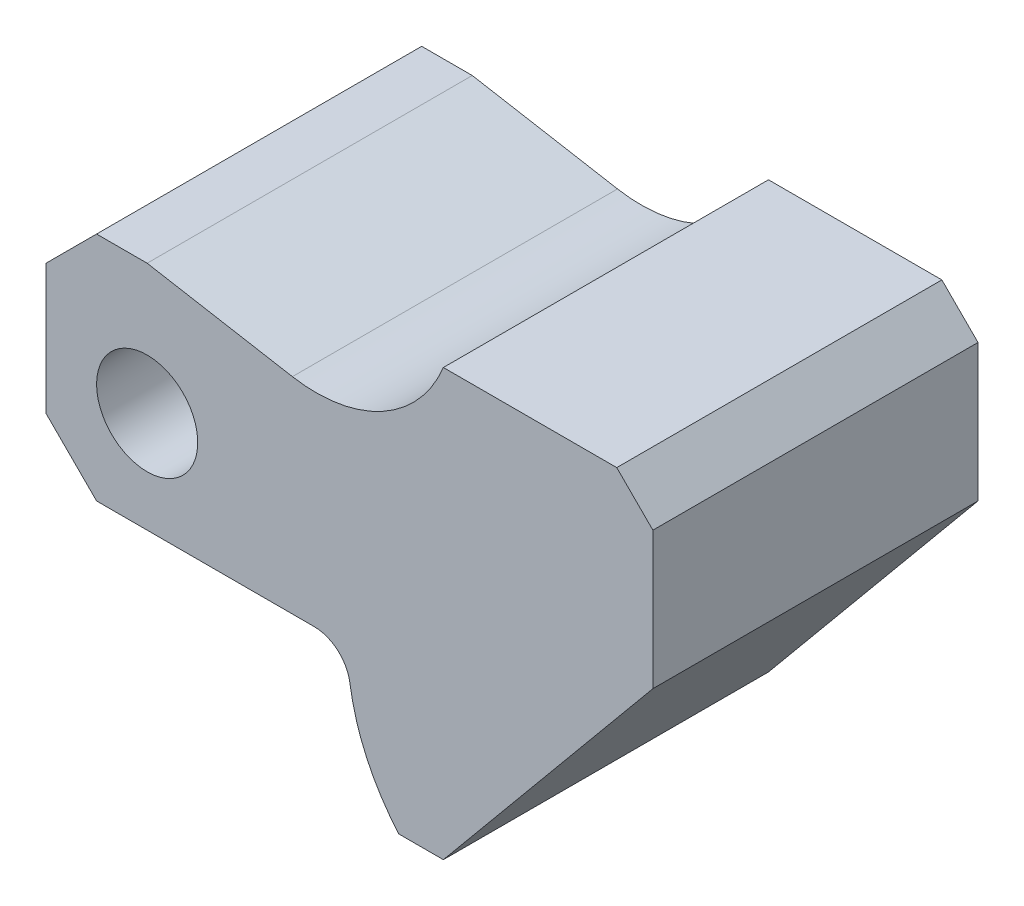
ISO-10303-21;
HEADER;
FILE_DESCRIPTION(('STEP AP214'),'2;1');
FILE_NAME('part.step','',(''),(''),'','','');
FILE_SCHEMA(('AUTOMOTIVE_DESIGN { 1 0 10303 214 1 1 1 1 }'));
ENDSEC;
DATA;
#1=APPLICATION_CONTEXT('core data for automotive mechanical design processes');
#2=APPLICATION_PROTOCOL_DEFINITION('international standard','automotive_design',2000,#1);
#3=PRODUCT_CONTEXT('',#1,'mechanical');
#4=PRODUCT('Part','Part','',(#3));
#5=PRODUCT_RELATED_PRODUCT_CATEGORY('part','',(#4));
#6=PRODUCT_DEFINITION_FORMATION('','',#4);
#7=PRODUCT_DEFINITION_CONTEXT('part definition',#1,'design');
#8=PRODUCT_DEFINITION('design','',#6,#7);
#9=PRODUCT_DEFINITION_SHAPE('','',#8);
#10=(LENGTH_UNIT() NAMED_UNIT(*) SI_UNIT(.MILLI.,.METRE.));
#11=(NAMED_UNIT(*) PLANE_ANGLE_UNIT() SI_UNIT($,.RADIAN.));
#12=(NAMED_UNIT(*) SI_UNIT($,.STERADIAN.) SOLID_ANGLE_UNIT());
#13=UNCERTAINTY_MEASURE_WITH_UNIT(LENGTH_MEASURE(1.E-05),#10,'distance_accuracy_value','');
#14=(GEOMETRIC_REPRESENTATION_CONTEXT(3) GLOBAL_UNCERTAINTY_ASSIGNED_CONTEXT((#13)) GLOBAL_UNIT_ASSIGNED_CONTEXT((#10,
#11,#12)) REPRESENTATION_CONTEXT('',''));
#15=CARTESIAN_POINT('',(0.,0.,0.));
#16=DIRECTION('',(0.,0.,1.));
#17=DIRECTION('',(1.,0.,0.));
#18=AXIS2_PLACEMENT_3D('',#15,#16,#17);
#19=CARTESIAN_POINT('',(20.4136649917998,3.9356435748019,45.));
#20=DIRECTION('',(0.,0.,-1.));
#21=DIRECTION('',(-1.,0.,0.));
#22=AXIS2_PLACEMENT_3D('',#19,#20,#21);
#23=PLANE('',#22);
#24=CARTESIAN_POINT('',(20.4136649917998,3.9356435748019,45.));
#25=DIRECTION('',(0.,0.,-1.));
#26=DIRECTION('',(-1.,0.,0.));
#27=AXIS2_PLACEMENT_3D('',#24,#25,#26);
#28=CIRCLE('',#27,19.);
#29=CARTESIAN_POINT('',(38.0103072641149,-3.23081864446441,45.));
#30=VERTEX_POINT('',#29);
#31=CARTESIAN_POINT('',(17.1143496161281,-14.7757037324301,45.));
#32=VERTEX_POINT('',#31);
#33=EDGE_CURVE('E224',#30,#32,#28,.T.);
#34=ORIENTED_EDGE('',*,*,#33,.T.);
#35=DIRECTION('',(-0.984807753012208,0.173648177666931,0.));
#36=VECTOR('',#35,1.);
#37=CARTESIAN_POINT('',(-2.98969273588509,-11.2308186444645,45.));
#38=LINE('',#37,#36);
#39=CARTESIAN_POINT('',(-2.98969273588509,-11.2308186444645,45.));
#40=VERTEX_POINT('',#39);
#41=EDGE_CURVE('E124',#32,#40,#38,.T.);
#42=ORIENTED_EDGE('',*,*,#41,.T.);
#43=DIRECTION('',(-1.,0.,0.));
#44=VECTOR('',#43,1.);
#45=CARTESIAN_POINT('',(-9.98969273588509,-11.2308186444645,45.));
#46=LINE('',#45,#44);
#47=CARTESIAN_POINT('',(-9.98969273588509,-11.2308186444645,45.));
#48=VERTEX_POINT('',#47);
#49=EDGE_CURVE('E269',#40,#48,#46,.T.);
#50=ORIENTED_EDGE('',*,*,#49,.T.);
#51=DIRECTION('',(-0.707106781186547,-0.707106781186548,0.));
#52=VECTOR('',#51,1.);
#53=CARTESIAN_POINT('',(-16.9896927358851,-18.2308186444645,45.));
#54=LINE('',#53,#52);
#55=CARTESIAN_POINT('',(-16.9896927358851,-18.2308186444645,45.));
#56=VERTEX_POINT('',#55);
#57=EDGE_CURVE('E289',#48,#56,#54,.T.);
#58=ORIENTED_EDGE('',*,*,#57,.T.);
#59=DIRECTION('',(0.,-1.,0.));
#60=VECTOR('',#59,1.);
#61=CARTESIAN_POINT('',(-16.9896927358851,-36.2308186444645,45.));
#62=LINE('',#61,#60);
#63=CARTESIAN_POINT('',(-16.9896927358851,-36.2308186444645,45.));
#64=VERTEX_POINT('',#63);
#65=EDGE_CURVE('E285',#56,#64,#62,.T.);
#66=ORIENTED_EDGE('',*,*,#65,.T.);
#67=DIRECTION('',(0.707106781186549,-0.707106781186546,0.));
#68=VECTOR('',#67,1.);
#69=CARTESIAN_POINT('',(-9.98969273588507,-43.2308186444645,45.));
#70=LINE('',#69,#68);
#71=CARTESIAN_POINT('',(-9.98969273588507,-43.2308186444645,45.));
#72=VERTEX_POINT('',#71);
#73=EDGE_CURVE('E288',#64,#72,#70,.T.);
#74=ORIENTED_EDGE('',*,*,#73,.T.);
#75=DIRECTION('',(1.,0.,0.));
#76=VECTOR('',#75,1.);
#77=CARTESIAN_POINT('',(20.1228209653716,-43.2308186444644,45.));
#78=LINE('',#77,#76);
#79=CARTESIAN_POINT('',(20.1228209653716,-43.2308186444645,45.));
#80=VERTEX_POINT('',#79);
#81=EDGE_CURVE('E293',#72,#80,#78,.T.);
#82=ORIENTED_EDGE('',*,*,#81,.T.);
#83=CARTESIAN_POINT('',(20.1228209653716,-48.2308186444645,45.));
#84=DIRECTION('',(0.,0.,-1.));
#85=DIRECTION('',(1.,0.,0.));
#86=AXIS2_PLACEMENT_3D('',#83,#84,#85);
#87=CIRCLE('',#86,5.00000000000001);
#88=CARTESIAN_POINT('',(25.0684597067834,-47.4955245268174,45.));
#89=VERTEX_POINT('',#88);
#90=EDGE_CURVE('E300',#80,#89,#87,.T.);
#91=ORIENTED_EDGE('',*,*,#90,.T.);
#92=CARTESIAN_POINT('',(53.7531644069721,-43.2308186444644,45.));
#93=DIRECTION('',(0.,0.,1.));
#94=DIRECTION('',(-1.,0.,0.));
#95=AXIS2_PLACEMENT_3D('',#92,#93,#94);
#96=CIRCLE('',#95,29.);
#97=CARTESIAN_POINT('',(31.8442621067654,-62.2308186444644,45.));
#98=VERTEX_POINT('',#97);
#99=EDGE_CURVE('E303',#89,#98,#96,.T.);
#100=ORIENTED_EDGE('',*,*,#99,.T.);
#101=DIRECTION('',(1.,0.,0.));
#102=VECTOR('',#101,1.);
#103=CARTESIAN_POINT('',(38.0103072641149,-62.2308186444644,45.));
#104=LINE('',#103,#102);
#105=CARTESIAN_POINT('',(38.0103072641149,-62.2308186444644,45.));
#106=VERTEX_POINT('',#105);
#107=EDGE_CURVE('E306',#98,#106,#104,.T.);
#108=ORIENTED_EDGE('',*,*,#107,.T.);
#109=DIRECTION('',(0.638017864750323,0.770021560905562,0.));
#110=VECTOR('',#109,1.);
#111=CARTESIAN_POINT('',(67.0103072641149,-27.2308186444644,45.));
#112=LINE('',#111,#110);
#113=CARTESIAN_POINT('',(67.0103072641149,-27.2308186444644,45.));
#114=VERTEX_POINT('',#113);
#115=EDGE_CURVE('E161',#106,#114,#112,.T.);
#116=ORIENTED_EDGE('',*,*,#115,.T.);
#117=DIRECTION('',(0.,1.,0.));
#118=VECTOR('',#117,1.);
#119=CARTESIAN_POINT('',(67.0103072641149,-8.23081864446441,45.));
#120=LINE('',#119,#118);
#121=CARTESIAN_POINT('',(67.0103072641149,-8.23081864446441,45.));
#122=VERTEX_POINT('',#121);
#123=EDGE_CURVE('E155',#114,#122,#120,.T.);
#124=ORIENTED_EDGE('',*,*,#123,.T.);
#125=DIRECTION('',(-0.707106781186546,0.707106781186549,0.));
#126=VECTOR('',#125,1.);
#127=CARTESIAN_POINT('',(62.0103072641149,-3.23081864446441,45.));
#128=LINE('',#127,#126);
#129=CARTESIAN_POINT('',(62.0103072641149,-3.23081864446441,45.));
#130=VERTEX_POINT('',#129);
#131=EDGE_CURVE('E159',#122,#130,#128,.T.);
#132=ORIENTED_EDGE('',*,*,#131,.T.);
#133=DIRECTION('',(-1.,0.,0.));
#134=VECTOR('',#133,1.);
#135=CARTESIAN_POINT('',(38.0103072641149,-3.23081864446441,45.));
#136=LINE('',#135,#134);
#137=EDGE_CURVE('E63',#130,#30,#136,.T.);
#138=ORIENTED_EDGE('',*,*,#137,.T.);
#139=EDGE_LOOP('',(#34,#42,#50,#58,#66,#74,#82,#91,#100,#108,#116,#124,#132,#138));
#140=FACE_BOUND('',#139,.T.);
#141=CARTESIAN_POINT('',(-2.98969273588509,-29.2308186444645,45.));
#142=DIRECTION('',(0.,0.,1.));
#143=DIRECTION('',(1.,0.,0.));
#144=AXIS2_PLACEMENT_3D('',#141,#142,#143);
#145=CIRCLE('',#144,7.);
#146=CARTESIAN_POINT('',(-9.98969273588508,-29.2308186444645,45.));
#147=VERTEX_POINT('',#146);
#148=EDGE_CURVE('E188',#147,#147,#145,.T.);
#149=ORIENTED_EDGE('',*,*,#148,.F.);
#150=EDGE_LOOP('',(#149));
#151=FACE_BOUND('',#150,.T.);
#152=ADVANCED_FACE('F45',(#140,#151),#23,.F.);
#153=CARTESIAN_POINT('',(20.4136649917998,3.9356435748019,0.));
#154=DIRECTION('',(0.,0.,-1.));
#155=DIRECTION('',(-1.,0.,0.));
#156=AXIS2_PLACEMENT_3D('',#153,#154,#155);
#157=PLANE('',#156);
#158=CARTESIAN_POINT('',(20.4136649917998,3.9356435748019,0.));
#159=DIRECTION('',(0.,0.,-1.));
#160=DIRECTION('',(-1.,0.,0.));
#161=AXIS2_PLACEMENT_3D('',#158,#159,#160);
#162=CIRCLE('',#161,19.);
#163=CARTESIAN_POINT('',(38.0103072641149,-3.23081864446441,0.));
#164=VERTEX_POINT('',#163);
#165=CARTESIAN_POINT('',(17.1143496161281,-14.7757037324301,0.));
#166=VERTEX_POINT('',#165);
#167=EDGE_CURVE('E183',#164,#166,#162,.T.);
#168=ORIENTED_EDGE('',*,*,#167,.F.);
#169=DIRECTION('',(-1.,0.,0.));
#170=VECTOR('',#169,1.);
#171=CARTESIAN_POINT('',(38.0103072641149,-3.23081864446441,0.));
#172=LINE('',#171,#170);
#173=CARTESIAN_POINT('',(62.0103072641149,-3.23081864446441,0.));
#174=VERTEX_POINT('',#173);
#175=EDGE_CURVE('E116',#174,#164,#172,.T.);
#176=ORIENTED_EDGE('',*,*,#175,.F.);
#177=DIRECTION('',(-0.707106781186546,0.707106781186549,0.));
#178=VECTOR('',#177,1.);
#179=CARTESIAN_POINT('',(62.0103072641149,-3.23081864446441,0.));
#180=LINE('',#179,#178);
#181=CARTESIAN_POINT('',(67.0103072641149,-8.23081864446441,0.));
#182=VERTEX_POINT('',#181);
#183=EDGE_CURVE('E110',#182,#174,#180,.T.);
#184=ORIENTED_EDGE('',*,*,#183,.F.);
#185=DIRECTION('',(0.,1.,0.));
#186=VECTOR('',#185,1.);
#187=CARTESIAN_POINT('',(67.0103072641149,-8.23081864446441,0.));
#188=LINE('',#187,#186);
#189=CARTESIAN_POINT('',(67.0103072641149,-27.2308186444644,0.));
#190=VERTEX_POINT('',#189);
#191=EDGE_CURVE('E170',#190,#182,#188,.T.);
#192=ORIENTED_EDGE('',*,*,#191,.F.);
#193=DIRECTION('',(0.638017864750323,0.770021560905562,0.));
#194=VECTOR('',#193,1.);
#195=CARTESIAN_POINT('',(67.0103072641149,-27.2308186444644,0.));
#196=LINE('',#195,#194);
#197=CARTESIAN_POINT('',(38.0103072641149,-62.2308186444644,0.));
#198=VERTEX_POINT('',#197);
#199=EDGE_CURVE('E215',#198,#190,#196,.T.);
#200=ORIENTED_EDGE('',*,*,#199,.F.);
#201=DIRECTION('',(1.,0.,0.));
#202=VECTOR('',#201,1.);
#203=CARTESIAN_POINT('',(38.0103072641149,-62.2308186444644,0.));
#204=LINE('',#203,#202);
#205=CARTESIAN_POINT('',(31.8442621067654,-62.2308186444644,0.));
#206=VERTEX_POINT('',#205);
#207=EDGE_CURVE('E212',#206,#198,#204,.T.);
#208=ORIENTED_EDGE('',*,*,#207,.F.);
#209=CARTESIAN_POINT('',(53.7531644069721,-43.2308186444644,0.));
#210=DIRECTION('',(0.,0.,1.));
#211=DIRECTION('',(-1.,0.,0.));
#212=AXIS2_PLACEMENT_3D('',#209,#210,#211);
#213=CIRCLE('',#212,29.);
#214=CARTESIAN_POINT('',(25.0684597067834,-47.4955245268174,0.));
#215=VERTEX_POINT('',#214);
#216=EDGE_CURVE('E209',#215,#206,#213,.T.);
#217=ORIENTED_EDGE('',*,*,#216,.F.);
#218=CARTESIAN_POINT('',(20.1228209653716,-48.2308186444645,0.));
#219=DIRECTION('',(0.,0.,-1.));
#220=DIRECTION('',(1.,0.,0.));
#221=AXIS2_PLACEMENT_3D('',#218,#219,#220);
#222=CIRCLE('',#221,5.00000000000001);
#223=CARTESIAN_POINT('',(20.1228209653716,-43.2308186444645,0.));
#224=VERTEX_POINT('',#223);
#225=EDGE_CURVE('E206',#224,#215,#222,.T.);
#226=ORIENTED_EDGE('',*,*,#225,.F.);
#227=DIRECTION('',(1.,0.,0.));
#228=VECTOR('',#227,1.);
#229=CARTESIAN_POINT('',(20.1228209653716,-43.2308186444644,0.));
#230=LINE('',#229,#228);
#231=CARTESIAN_POINT('',(-9.98969273588507,-43.2308186444645,0.));
#232=VERTEX_POINT('',#231);
#233=EDGE_CURVE('E203',#232,#224,#230,.T.);
#234=ORIENTED_EDGE('',*,*,#233,.F.);
#235=DIRECTION('',(0.707106781186549,-0.707106781186546,0.));
#236=VECTOR('',#235,1.);
#237=CARTESIAN_POINT('',(-9.98969273588507,-43.2308186444645,0.));
#238=LINE('',#237,#236);
#239=CARTESIAN_POINT('',(-16.9896927358851,-36.2308186444645,0.));
#240=VERTEX_POINT('',#239);
#241=EDGE_CURVE('E200',#240,#232,#238,.T.);
#242=ORIENTED_EDGE('',*,*,#241,.F.);
#243=DIRECTION('',(0.,-1.,0.));
#244=VECTOR('',#243,1.);
#245=CARTESIAN_POINT('',(-16.9896927358851,-36.2308186444645,0.));
#246=LINE('',#245,#244);
#247=CARTESIAN_POINT('',(-16.9896927358851,-18.2308186444645,0.));
#248=VERTEX_POINT('',#247);
#249=EDGE_CURVE('E197',#248,#240,#246,.T.);
#250=ORIENTED_EDGE('',*,*,#249,.F.);
#251=DIRECTION('',(-0.707106781186547,-0.707106781186548,0.));
#252=VECTOR('',#251,1.);
#253=CARTESIAN_POINT('',(-16.9896927358851,-18.2308186444645,0.));
#254=LINE('',#253,#252);
#255=CARTESIAN_POINT('',(-9.98969273588509,-11.2308186444645,0.));
#256=VERTEX_POINT('',#255);
#257=EDGE_CURVE('E194',#256,#248,#254,.T.);
#258=ORIENTED_EDGE('',*,*,#257,.F.);
#259=DIRECTION('',(-1.,0.,0.));
#260=VECTOR('',#259,1.);
#261=CARTESIAN_POINT('',(-9.98969273588509,-11.2308186444645,0.));
#262=LINE('',#261,#260);
#263=CARTESIAN_POINT('',(-2.98969273588509,-11.2308186444645,0.));
#264=VERTEX_POINT('',#263);
#265=EDGE_CURVE('E191',#264,#256,#262,.T.);
#266=ORIENTED_EDGE('',*,*,#265,.F.);
#267=DIRECTION('',(-0.984807753012208,0.173648177666931,0.));
#268=VECTOR('',#267,1.);
#269=CARTESIAN_POINT('',(-2.98969273588509,-11.2308186444645,0.));
#270=LINE('',#269,#268);
#271=EDGE_CURVE('E187',#166,#264,#270,.T.);
#272=ORIENTED_EDGE('',*,*,#271,.F.);
#273=EDGE_LOOP('',(#168,#176,#184,#192,#200,#208,#217,#226,#234,#242,#250,#258,#266,#272));
#274=FACE_BOUND('',#273,.T.);
#275=CARTESIAN_POINT('',(-2.98969273588509,-29.2308186444645,0.));
#276=DIRECTION('',(0.,0.,1.));
#277=DIRECTION('',(1.,0.,0.));
#278=AXIS2_PLACEMENT_3D('',#275,#276,#277);
#279=CIRCLE('',#278,7.);
#280=CARTESIAN_POINT('',(-9.98969273588508,-29.2308186444645,0.));
#281=VERTEX_POINT('',#280);
#282=EDGE_CURVE('E481',#281,#281,#279,.T.);
#283=ORIENTED_EDGE('',*,*,#282,.T.);
#284=EDGE_LOOP('',(#283));
#285=FACE_BOUND('',#284,.T.);
#286=ADVANCED_FACE('F273',(#274,#285),#157,.T.);
#287=CARTESIAN_POINT('',(20.4136649917998,3.9356435748019,45.));
#288=DIRECTION('',(0.,0.,-1.));
#289=DIRECTION('',(-1.,0.,0.));
#290=AXIS2_PLACEMENT_3D('',#287,#288,#289);
#291=CYLINDRICAL_SURFACE('',#290,19.);
#292=ORIENTED_EDGE('',*,*,#167,.T.);
#293=DIRECTION('',(0.,0.,-1.));
#294=VECTOR('',#293,1.);
#295=CARTESIAN_POINT('',(17.1143496161281,-14.7757037324301,45.));
#296=LINE('',#295,#294);
#297=EDGE_CURVE('E11',#32,#166,#296,.T.);
#298=ORIENTED_EDGE('',*,*,#297,.F.);
#299=ORIENTED_EDGE('',*,*,#33,.F.);
#300=DIRECTION('',(0.,0.,-1.));
#301=VECTOR('',#300,1.);
#302=CARTESIAN_POINT('',(38.0103072641149,-3.23081864446441,45.));
#303=LINE('',#302,#301);
#304=EDGE_CURVE('E179',#30,#164,#303,.T.);
#305=ORIENTED_EDGE('',*,*,#304,.T.);
#306=EDGE_LOOP('',(#292,#298,#299,#305));
#307=FACE_BOUND('',#306,.T.);
#308=ADVANCED_FACE('F47',(#307),#291,.F.);
#309=CARTESIAN_POINT('',(-2.98969273588509,-11.2308186444645,45.));
#310=DIRECTION('',(-0.173648177666931,-0.984807753012208,0.));
#311=DIRECTION('',(0.984807753012208,-0.173648177666931,0.));
#312=AXIS2_PLACEMENT_3D('',#309,#310,#311);
#313=PLANE('',#312);
#314=ORIENTED_EDGE('',*,*,#271,.T.);
#315=DIRECTION('',(0.,0.,-1.));
#316=VECTOR('',#315,1.);
#317=CARTESIAN_POINT('',(-2.98969273588509,-11.2308186444645,45.));
#318=LINE('',#317,#316);
#319=EDGE_CURVE('E55',#40,#264,#318,.T.);
#320=ORIENTED_EDGE('',*,*,#319,.F.);
#321=ORIENTED_EDGE('',*,*,#41,.F.);
#322=ORIENTED_EDGE('',*,*,#297,.T.);
#323=EDGE_LOOP('',(#314,#320,#321,#322));
#324=FACE_BOUND('',#323,.T.);
#325=ADVANCED_FACE('F342',(#324),#313,.F.);
#326=CARTESIAN_POINT('',(-9.98969273588509,-11.2308186444645,45.));
#327=DIRECTION('',(0.,-1.,0.));
#328=DIRECTION('',(0.,0.,-1.));
#329=AXIS2_PLACEMENT_3D('',#326,#327,#328);
#330=PLANE('',#329);
#331=ORIENTED_EDGE('',*,*,#265,.T.);
#332=DIRECTION('',(0.,0.,-1.));
#333=VECTOR('',#332,1.);
#334=CARTESIAN_POINT('',(-9.98969273588509,-11.2308186444645,45.));
#335=LINE('',#334,#333);
#336=EDGE_CURVE('E259',#48,#256,#335,.T.);
#337=ORIENTED_EDGE('',*,*,#336,.F.);
#338=ORIENTED_EDGE('',*,*,#49,.F.);
#339=ORIENTED_EDGE('',*,*,#319,.T.);
#340=EDGE_LOOP('',(#331,#337,#338,#339));
#341=FACE_BOUND('',#340,.T.);
#342=ADVANCED_FACE('F267',(#341),#330,.F.);
#343=CARTESIAN_POINT('',(-16.9896927358851,-18.2308186444645,45.));
#344=DIRECTION('',(0.707106781186548,-0.707106781186547,0.));
#345=DIRECTION('',(0.707106781186547,0.707106781186548,0.));
#346=AXIS2_PLACEMENT_3D('',#343,#344,#345);
#347=PLANE('',#346);
#348=ORIENTED_EDGE('',*,*,#257,.T.);
#349=DIRECTION('',(0.,0.,-1.));
#350=VECTOR('',#349,1.);
#351=CARTESIAN_POINT('',(-16.9896927358851,-18.2308186444645,45.));
#352=LINE('',#351,#350);
#353=EDGE_CURVE('E255',#56,#248,#352,.T.);
#354=ORIENTED_EDGE('',*,*,#353,.F.);
#355=ORIENTED_EDGE('',*,*,#57,.F.);
#356=ORIENTED_EDGE('',*,*,#336,.T.);
#357=EDGE_LOOP('',(#348,#354,#355,#356));
#358=FACE_BOUND('',#357,.T.);
#359=ADVANCED_FACE('F279',(#358),#347,.F.);
#360=CARTESIAN_POINT('',(-16.9896927358851,-36.2308186444645,45.));
#361=DIRECTION('',(1.,0.,0.));
#362=DIRECTION('',(0.,0.,-1.));
#363=AXIS2_PLACEMENT_3D('',#360,#361,#362);
#364=PLANE('',#363);
#365=ORIENTED_EDGE('',*,*,#249,.T.);
#366=DIRECTION('',(0.,0.,-1.));
#367=VECTOR('',#366,1.);
#368=CARTESIAN_POINT('',(-16.9896927358851,-36.2308186444645,45.));
#369=LINE('',#368,#367);
#370=EDGE_CURVE('E251',#64,#240,#369,.T.);
#371=ORIENTED_EDGE('',*,*,#370,.F.);
#372=ORIENTED_EDGE('',*,*,#65,.F.);
#373=ORIENTED_EDGE('',*,*,#353,.T.);
#374=EDGE_LOOP('',(#365,#371,#372,#373));
#375=FACE_BOUND('',#374,.T.);
#376=ADVANCED_FACE('F283',(#375),#364,.F.);
#377=CARTESIAN_POINT('',(-9.98969273588507,-43.2308186444645,45.));
#378=DIRECTION('',(0.707106781186546,0.707106781186549,0.));
#379=DIRECTION('',(-0.707106781186549,0.707106781186546,0.));
#380=AXIS2_PLACEMENT_3D('',#377,#378,#379);
#381=PLANE('',#380);
#382=ORIENTED_EDGE('',*,*,#241,.T.);
#383=DIRECTION('',(0.,0.,-1.));
#384=VECTOR('',#383,1.);
#385=CARTESIAN_POINT('',(-9.98969273588507,-43.2308186444645,45.));
#386=LINE('',#385,#384);
#387=EDGE_CURVE('E247',#72,#232,#386,.T.);
#388=ORIENTED_EDGE('',*,*,#387,.F.);
#389=ORIENTED_EDGE('',*,*,#73,.F.);
#390=ORIENTED_EDGE('',*,*,#370,.T.);
#391=EDGE_LOOP('',(#382,#388,#389,#390));
#392=FACE_BOUND('',#391,.T.);
#393=ADVANCED_FACE('F355',(#392),#381,.F.);
#394=CARTESIAN_POINT('',(20.1228209653716,-43.2308186444644,45.));
#395=DIRECTION('',(0.,1.,0.));
#396=DIRECTION('',(-1.,0.,0.));
#397=AXIS2_PLACEMENT_3D('',#394,#395,#396);
#398=PLANE('',#397);
#399=ORIENTED_EDGE('',*,*,#233,.T.);
#400=DIRECTION('',(0.,0.,-1.));
#401=VECTOR('',#400,1.);
#402=CARTESIAN_POINT('',(20.1228209653716,-43.2308186444645,45.));
#403=LINE('',#402,#401);
#404=EDGE_CURVE('E243',#80,#224,#403,.T.);
#405=ORIENTED_EDGE('',*,*,#404,.F.);
#406=ORIENTED_EDGE('',*,*,#81,.F.);
#407=ORIENTED_EDGE('',*,*,#387,.T.);
#408=EDGE_LOOP('',(#399,#405,#406,#407));
#409=FACE_BOUND('',#408,.T.);
#410=ADVANCED_FACE('F358',(#409),#398,.F.);
#411=CARTESIAN_POINT('',(20.1228209653716,-48.2308186444645,45.));
#412=DIRECTION('',(0.,0.,-1.));
#413=DIRECTION('',(-1.,0.,0.));
#414=AXIS2_PLACEMENT_3D('',#411,#412,#413);
#415=CYLINDRICAL_SURFACE('',#414,5.00000000000001);
#416=ORIENTED_EDGE('',*,*,#225,.T.);
#417=DIRECTION('',(0.,0.,-1.));
#418=VECTOR('',#417,1.);
#419=CARTESIAN_POINT('',(25.0684597067834,-47.4955245268174,45.));
#420=LINE('',#419,#418);
#421=EDGE_CURVE('E239',#89,#215,#420,.T.);
#422=ORIENTED_EDGE('',*,*,#421,.F.);
#423=ORIENTED_EDGE('',*,*,#90,.F.);
#424=ORIENTED_EDGE('',*,*,#404,.T.);
#425=EDGE_LOOP('',(#416,#422,#423,#424));
#426=FACE_BOUND('',#425,.T.);
#427=ADVANCED_FACE('F362',(#426),#415,.F.);
#428=CARTESIAN_POINT('',(53.7531644069721,-43.2308186444644,45.));
#429=DIRECTION('',(0.,0.,-1.));
#430=DIRECTION('',(-1.,0.,0.));
#431=AXIS2_PLACEMENT_3D('',#428,#429,#430);
#432=CYLINDRICAL_SURFACE('',#431,29.);
#433=ORIENTED_EDGE('',*,*,#216,.T.);
#434=DIRECTION('',(0.,0.,-1.));
#435=VECTOR('',#434,1.);
#436=CARTESIAN_POINT('',(31.8442621067654,-62.2308186444644,45.));
#437=LINE('',#436,#435);
#438=EDGE_CURVE('E235',#98,#206,#437,.T.);
#439=ORIENTED_EDGE('',*,*,#438,.F.);
#440=ORIENTED_EDGE('',*,*,#99,.F.);
#441=ORIENTED_EDGE('',*,*,#421,.T.);
#442=EDGE_LOOP('',(#433,#439,#440,#441));
#443=FACE_BOUND('',#442,.T.);
#444=ADVANCED_FACE('F366',(#443),#432,.T.);
#445=CARTESIAN_POINT('',(38.0103072641149,-62.2308186444644,45.));
#446=DIRECTION('',(0.,1.,0.));
#447=DIRECTION('',(0.,0.,1.));
#448=AXIS2_PLACEMENT_3D('',#445,#446,#447);
#449=PLANE('',#448);
#450=ORIENTED_EDGE('',*,*,#207,.T.);
#451=DIRECTION('',(0.,0.,-1.));
#452=VECTOR('',#451,1.);
#453=CARTESIAN_POINT('',(38.0103072641149,-62.2308186444644,45.));
#454=LINE('',#453,#452);
#455=EDGE_CURVE('E231',#106,#198,#454,.T.);
#456=ORIENTED_EDGE('',*,*,#455,.F.);
#457=ORIENTED_EDGE('',*,*,#107,.F.);
#458=ORIENTED_EDGE('',*,*,#438,.T.);
#459=EDGE_LOOP('',(#450,#456,#457,#458));
#460=FACE_BOUND('',#459,.T.);
#461=ADVANCED_FACE('F314',(#460),#449,.F.);
#462=CARTESIAN_POINT('',(67.0103072641149,-27.2308186444644,45.));
#463=DIRECTION('',(-0.770021560905562,0.638017864750323,0.));
#464=DIRECTION('',(-0.638017864750323,-0.770021560905562,0.));
#465=AXIS2_PLACEMENT_3D('',#462,#463,#464);
#466=PLANE('',#465);
#467=ORIENTED_EDGE('',*,*,#199,.T.);
#468=DIRECTION('',(0.,0.,-1.));
#469=VECTOR('',#468,1.);
#470=CARTESIAN_POINT('',(67.0103072641149,-27.2308186444644,45.));
#471=LINE('',#470,#469);
#472=EDGE_CURVE('E172',#114,#190,#471,.T.);
#473=ORIENTED_EDGE('',*,*,#472,.F.);
#474=ORIENTED_EDGE('',*,*,#115,.F.);
#475=ORIENTED_EDGE('',*,*,#455,.T.);
#476=EDGE_LOOP('',(#467,#473,#474,#475));
#477=FACE_BOUND('',#476,.T.);
#478=ADVANCED_FACE('F318',(#477),#466,.F.);
#479=CARTESIAN_POINT('',(67.0103072641149,-8.23081864446441,45.));
#480=DIRECTION('',(-1.,0.,0.));
#481=DIRECTION('',(0.,0.,1.));
#482=AXIS2_PLACEMENT_3D('',#479,#480,#481);
#483=PLANE('',#482);
#484=ORIENTED_EDGE('',*,*,#191,.T.);
#485=DIRECTION('',(0.,0.,-1.));
#486=VECTOR('',#485,1.);
#487=CARTESIAN_POINT('',(67.0103072641149,-8.23081864446441,45.));
#488=LINE('',#487,#486);
#489=EDGE_CURVE('E167',#122,#182,#488,.T.);
#490=ORIENTED_EDGE('',*,*,#489,.F.);
#491=ORIENTED_EDGE('',*,*,#123,.F.);
#492=ORIENTED_EDGE('',*,*,#472,.T.);
#493=EDGE_LOOP('',(#484,#490,#491,#492));
#494=FACE_BOUND('',#493,.T.);
#495=ADVANCED_FACE('F168',(#494),#483,.F.);
#496=CARTESIAN_POINT('',(62.0103072641149,-3.23081864446441,45.));
#497=DIRECTION('',(-0.707106781186549,-0.707106781186546,0.));
#498=DIRECTION('',(0.707106781186546,-0.707106781186549,0.));
#499=AXIS2_PLACEMENT_3D('',#496,#497,#498);
#500=PLANE('',#499);
#501=ORIENTED_EDGE('',*,*,#183,.T.);
#502=DIRECTION('',(0.,0.,-1.));
#503=VECTOR('',#502,1.);
#504=CARTESIAN_POINT('',(62.0103072641149,-3.23081864446441,45.));
#505=LINE('',#504,#503);
#506=EDGE_CURVE('E173',#130,#174,#505,.T.);
#507=ORIENTED_EDGE('',*,*,#506,.F.);
#508=ORIENTED_EDGE('',*,*,#131,.F.);
#509=ORIENTED_EDGE('',*,*,#489,.T.);
#510=EDGE_LOOP('',(#501,#507,#508,#509));
#511=FACE_BOUND('',#510,.T.);
#512=ADVANCED_FACE('F175',(#511),#500,.F.);
#513=CARTESIAN_POINT('',(38.0103072641149,-3.23081864446441,45.));
#514=DIRECTION('',(0.,-1.,0.));
#515=DIRECTION('',(1.,0.,0.));
#516=AXIS2_PLACEMENT_3D('',#513,#514,#515);
#517=PLANE('',#516);
#518=ORIENTED_EDGE('',*,*,#175,.T.);
#519=ORIENTED_EDGE('',*,*,#304,.F.);
#520=ORIENTED_EDGE('',*,*,#137,.F.);
#521=ORIENTED_EDGE('',*,*,#506,.T.);
#522=EDGE_LOOP('',(#518,#519,#520,#521));
#523=FACE_BOUND('',#522,.T.);
#524=ADVANCED_FACE('F322',(#523),#517,.F.);
#525=CARTESIAN_POINT('',(-2.98969273588509,-29.2308186444645,45.));
#526=DIRECTION('',(0.,0.,-1.));
#527=DIRECTION('',(-1.,0.,0.));
#528=AXIS2_PLACEMENT_3D('',#525,#526,#527);
#529=CYLINDRICAL_SURFACE('',#528,7.);
#530=CARTESIAN_POINT('',(-9.98969273588508,-29.2308186444645,45.));
#531=CARTESIAN_POINT('',(-9.98969273588508,-29.2308186444645,44.53125));
#532=CARTESIAN_POINT('',(-9.98969273588508,-29.2308186444645,44.0625));
#533=CARTESIAN_POINT('',(-9.98969273588508,-29.2308186444645,43.125));
#534=CARTESIAN_POINT('',(-9.98969273588508,-29.2308186444645,42.65625));
#535=CARTESIAN_POINT('',(-9.98969273588508,-29.2308186444645,41.71875));
#536=CARTESIAN_POINT('',(-9.98969273588508,-29.2308186444645,41.25));
#537=CARTESIAN_POINT('',(-9.98969273588508,-29.2308186444645,40.3125));
#538=CARTESIAN_POINT('',(-9.98969273588508,-29.2308186444645,39.84375));
#539=CARTESIAN_POINT('',(-9.98969273588508,-29.2308186444645,38.90625));
#540=CARTESIAN_POINT('',(-9.98969273588508,-29.2308186444645,38.4375));
#541=CARTESIAN_POINT('',(-9.98969273588508,-29.2308186444645,37.5));
#542=CARTESIAN_POINT('',(-9.98969273588508,-29.2308186444645,37.03125));
#543=CARTESIAN_POINT('',(-9.98969273588508,-29.2308186444645,36.09375));
#544=CARTESIAN_POINT('',(-9.98969273588508,-29.2308186444645,35.625));
#545=CARTESIAN_POINT('',(-9.98969273588508,-29.2308186444645,34.6875));
#546=CARTESIAN_POINT('',(-9.98969273588508,-29.2308186444645,34.21875));
#547=CARTESIAN_POINT('',(-9.98969273588508,-29.2308186444645,33.28125));
#548=CARTESIAN_POINT('',(-9.98969273588508,-29.2308186444645,32.8125));
#549=CARTESIAN_POINT('',(-9.98969273588508,-29.2308186444645,31.875));
#550=CARTESIAN_POINT('',(-9.98969273588508,-29.2308186444645,31.40625));
#551=CARTESIAN_POINT('',(-9.98969273588508,-29.2308186444645,30.46875));
#552=CARTESIAN_POINT('',(-9.98969273588508,-29.2308186444645,30.));
#553=CARTESIAN_POINT('',(-9.98969273588508,-29.2308186444645,29.0625));
#554=CARTESIAN_POINT('',(-9.98969273588508,-29.2308186444645,28.59375));
#555=CARTESIAN_POINT('',(-9.98969273588508,-29.2308186444645,27.65625));
#556=CARTESIAN_POINT('',(-9.98969273588508,-29.2308186444645,27.1875));
#557=CARTESIAN_POINT('',(-9.98969273588508,-29.2308186444645,26.25));
#558=CARTESIAN_POINT('',(-9.98969273588508,-29.2308186444645,25.78125));
#559=CARTESIAN_POINT('',(-9.98969273588508,-29.2308186444645,24.84375));
#560=CARTESIAN_POINT('',(-9.98969273588508,-29.2308186444645,24.375));
#561=CARTESIAN_POINT('',(-9.98969273588508,-29.2308186444645,23.4375));
#562=CARTESIAN_POINT('',(-9.98969273588508,-29.2308186444645,22.96875));
#563=CARTESIAN_POINT('',(-9.98969273588508,-29.2308186444645,22.03125));
#564=CARTESIAN_POINT('',(-9.98969273588508,-29.2308186444645,21.5625));
#565=CARTESIAN_POINT('',(-9.98969273588508,-29.2308186444645,20.625));
#566=CARTESIAN_POINT('',(-9.98969273588508,-29.2308186444645,20.15625));
#567=CARTESIAN_POINT('',(-9.98969273588508,-29.2308186444645,19.21875));
#568=CARTESIAN_POINT('',(-9.98969273588508,-29.2308186444645,18.75));
#569=CARTESIAN_POINT('',(-9.98969273588508,-29.2308186444645,17.8125));
#570=CARTESIAN_POINT('',(-9.98969273588508,-29.2308186444645,17.34375));
#571=CARTESIAN_POINT('',(-9.98969273588508,-29.2308186444645,16.40625));
#572=CARTESIAN_POINT('',(-9.98969273588508,-29.2308186444645,15.9375));
#573=CARTESIAN_POINT('',(-9.98969273588508,-29.2308186444645,15.));
#574=CARTESIAN_POINT('',(-9.98969273588508,-29.2308186444645,14.53125));
#575=CARTESIAN_POINT('',(-9.98969273588508,-29.2308186444645,13.59375));
#576=CARTESIAN_POINT('',(-9.98969273588508,-29.2308186444645,13.125));
#577=CARTESIAN_POINT('',(-9.98969273588508,-29.2308186444645,12.1875));
#578=CARTESIAN_POINT('',(-9.98969273588508,-29.2308186444645,11.71875));
#579=CARTESIAN_POINT('',(-9.98969273588508,-29.2308186444645,10.78125));
#580=CARTESIAN_POINT('',(-9.98969273588508,-29.2308186444645,10.3125));
#581=CARTESIAN_POINT('',(-9.98969273588508,-29.2308186444645,9.375));
#582=CARTESIAN_POINT('',(-9.98969273588508,-29.2308186444645,8.90625));
#583=CARTESIAN_POINT('',(-9.98969273588508,-29.2308186444645,7.96874999999999));
#584=CARTESIAN_POINT('',(-9.98969273588508,-29.2308186444645,7.5));
#585=CARTESIAN_POINT('',(-9.98969273588508,-29.2308186444645,6.5625));
#586=CARTESIAN_POINT('',(-9.98969273588508,-29.2308186444645,6.09375));
#587=CARTESIAN_POINT('',(-9.98969273588508,-29.2308186444645,5.15625));
#588=CARTESIAN_POINT('',(-9.98969273588508,-29.2308186444645,4.68749999999999));
#589=CARTESIAN_POINT('',(-9.98969273588508,-29.2308186444645,3.74999999999999));
#590=CARTESIAN_POINT('',(-9.98969273588508,-29.2308186444645,3.28124999999999));
#591=CARTESIAN_POINT('',(-9.98969273588508,-29.2308186444645,2.34374999999999));
#592=CARTESIAN_POINT('',(-9.98969273588508,-29.2308186444645,1.87499999999999));
#593=CARTESIAN_POINT('',(-9.98969273588508,-29.2308186444645,0.937499999999992));
#594=CARTESIAN_POINT('',(-9.98969273588508,-29.2308186444645,0.468749999999993));
#595=CARTESIAN_POINT('',(-9.98969273588508,-29.2308186444645,0.));
#596=B_SPLINE_CURVE_WITH_KNOTS('',3,(#530,#531,#532,#533,#534,#535,#536,#537,#538,#539,#540,
#541,#542,#543,#544,#545,#546,#547,#548,#549,#550,#551,#552,#553,#554,#555,#556,#557,#558,#559,
#560,#561,#562,#563,#564,#565,#566,#567,#568,#569,#570,#571,#572,#573,#574,#575,#576,#577,#578,
#579,#580,#581,#582,#583,#584,#585,#586,#587,#588,#589,#590,#591,#592,#593,#594,#595),
.UNSPECIFIED.,.F.,.F.,(4,2,2,2,2,2,2,2,2,2,2,2,2,2,2,2,2,2,2,2,2,2,2,2,2,2,2,2,2,2,2,2,4),(0.,
1.40625,2.8125,4.21875000000001,5.62500000000001,7.03125,8.4375,9.84375000000001,11.25,12.65625,
14.0625,15.46875,16.875,18.28125,19.6875,21.09375,22.5,23.90625,25.3125,26.71875,28.125,
29.53125,30.9375,32.34375,33.75,35.15625,36.5625,37.96875,39.375,40.78125,42.1875,43.59375,45.),.UNSPECIFIED.);
#597=EDGE_CURVE('BSEAM324',#147,#281,#596,.T.);
#598=ORIENTED_EDGE('',*,*,#148,.T.);
#599=ORIENTED_EDGE('',*,*,#282,.F.);
#600=ORIENTED_EDGE('',*,*,#597,.T.);
#601=ORIENTED_EDGE('',*,*,#597,.F.);
#602=EDGE_LOOP('',(#598,#600,#599,#601));
#603=FACE_BOUND('',#602,.T.);
#604=ADVANCED_FACE('F324',(#603),#529,.F.);
#605=CLOSED_SHELL('',(#152,#286,#308,#325,#342,#359,#376,#393,#410,#427,#444,#461,#478,#495,
#512,#524,#604));
#606=MANIFOLD_SOLID_BREP('B2',#605);
#607=ADVANCED_BREP_SHAPE_REPRESENTATION('',(#18,#606),#14);
#608=SHAPE_DEFINITION_REPRESENTATION(#9,#607);
ENDSEC;
END-ISO-10303-21;
